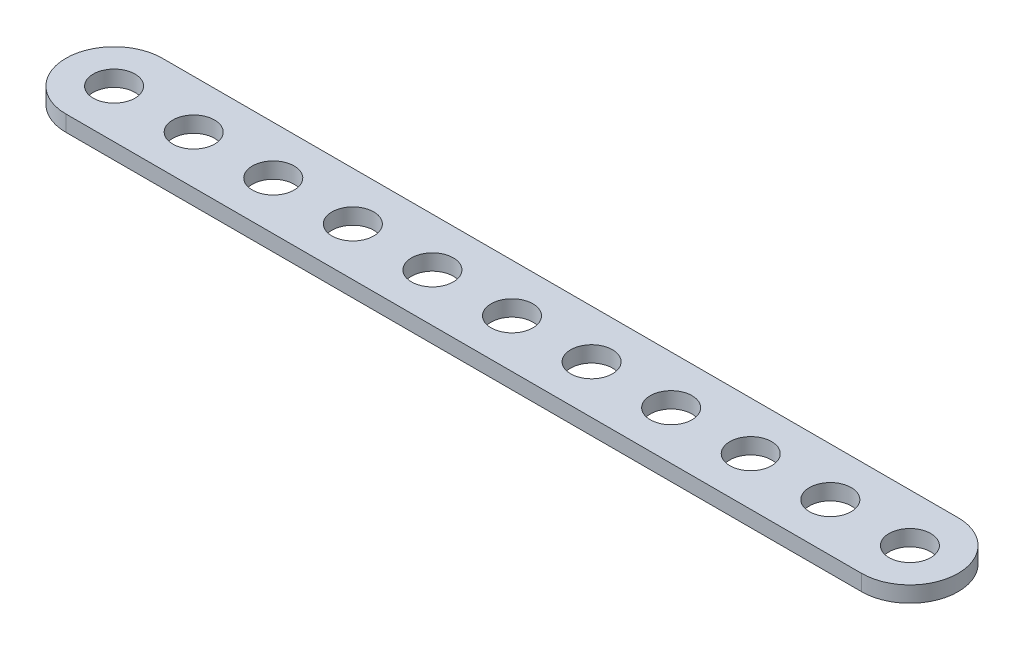
ISO-10303-21;
HEADER;
FILE_DESCRIPTION(('STEP AP214'),'2;1');
FILE_NAME('part.step','',(''),(''),'','','');
FILE_SCHEMA(('AUTOMOTIVE_DESIGN { 1 0 10303 214 1 1 1 1 }'));
ENDSEC;
DATA;
#1=APPLICATION_CONTEXT('core data for automotive mechanical design processes');
#2=APPLICATION_PROTOCOL_DEFINITION('international standard','automotive_design',2000,#1);
#3=PRODUCT_CONTEXT('',#1,'mechanical');
#4=PRODUCT('Part','Part','',(#3));
#5=PRODUCT_RELATED_PRODUCT_CATEGORY('part','',(#4));
#6=PRODUCT_DEFINITION_FORMATION('','',#4);
#7=PRODUCT_DEFINITION_CONTEXT('part definition',#1,'design');
#8=PRODUCT_DEFINITION('design','',#6,#7);
#9=PRODUCT_DEFINITION_SHAPE('','',#8);
#10=(LENGTH_UNIT() NAMED_UNIT(*) SI_UNIT(.MILLI.,.METRE.));
#11=(NAMED_UNIT(*) PLANE_ANGLE_UNIT() SI_UNIT($,.RADIAN.));
#12=(NAMED_UNIT(*) SI_UNIT($,.STERADIAN.) SOLID_ANGLE_UNIT());
#13=UNCERTAINTY_MEASURE_WITH_UNIT(LENGTH_MEASURE(1.E-05),#10,'distance_accuracy_value','');
#14=(GEOMETRIC_REPRESENTATION_CONTEXT(3) GLOBAL_UNCERTAINTY_ASSIGNED_CONTEXT((#13)) GLOBAL_UNIT_ASSIGNED_CONTEXT((#10,
#11,#12)) REPRESENTATION_CONTEXT('',''));
#15=CARTESIAN_POINT('',(0.,0.,0.));
#16=DIRECTION('',(0.,0.,1.));
#17=DIRECTION('',(1.,0.,0.));
#18=AXIS2_PLACEMENT_3D('',#15,#16,#17);
#19=CARTESIAN_POINT('',(0.,0.,0.));
#20=DIRECTION('',(0.,1.,0.));
#21=DIRECTION('',(0.,0.,1.));
#22=AXIS2_PLACEMENT_3D('',#19,#20,#21);
#23=PLANE('',#22);
#24=CARTESIAN_POINT('',(80.,0.,0.));
#25=DIRECTION('',(0.,-1.,0.));
#26=DIRECTION('',(0.,0.,-1.));
#27=AXIS2_PLACEMENT_3D('',#24,#25,#26);
#28=CIRCLE('',#27,4.85);
#29=CARTESIAN_POINT('',(80.,0.,4.85));
#30=VERTEX_POINT('',#29);
#31=CARTESIAN_POINT('',(80.,0.,-4.85));
#32=VERTEX_POINT('',#31);
#33=EDGE_CURVE('E55',#30,#32,#28,.F.);
#34=ORIENTED_EDGE('',*,*,#33,.F.);
#35=DIRECTION('',(-1.,0.,0.));
#36=VECTOR('',#35,1.);
#37=CARTESIAN_POINT('',(0.,0.,4.85));
#38=LINE('',#37,#36);
#39=CARTESIAN_POINT('',(0.,0.,4.85));
#40=VERTEX_POINT('',#39);
#41=EDGE_CURVE('E60',#30,#40,#38,.T.);
#42=ORIENTED_EDGE('',*,*,#41,.T.);
#43=CARTESIAN_POINT('',(0.,0.,0.));
#44=DIRECTION('',(0.,-1.,0.));
#45=DIRECTION('',(0.,0.,-1.));
#46=AXIS2_PLACEMENT_3D('',#43,#44,#45);
#47=CIRCLE('',#46,4.85);
#48=CARTESIAN_POINT('',(0.,0.,-4.85));
#49=VERTEX_POINT('',#48);
#50=EDGE_CURVE('E76',#49,#40,#47,.F.);
#51=ORIENTED_EDGE('',*,*,#50,.F.);
#52=DIRECTION('',(1.,0.,0.));
#53=VECTOR('',#52,1.);
#54=CARTESIAN_POINT('',(0.,0.,-4.85));
#55=LINE('',#54,#53);
#56=EDGE_CURVE('E61',#49,#32,#55,.T.);
#57=ORIENTED_EDGE('',*,*,#56,.T.);
#58=EDGE_LOOP('',(#34,#42,#51,#57));
#59=FACE_BOUND('',#58,.T.);
#60=CARTESIAN_POINT('',(0.,0.,0.));
#61=DIRECTION('',(0.,-1.,0.));
#62=DIRECTION('',(0.,0.,-1.));
#63=AXIS2_PLACEMENT_3D('',#60,#61,#62);
#64=CIRCLE('',#63,2.1);
#65=CARTESIAN_POINT('',(0.,0.,-2.1));
#66=VERTEX_POINT('',#65);
#67=EDGE_CURVE('E64',#66,#66,#64,.F.);
#68=ORIENTED_EDGE('',*,*,#67,.T.);
#69=EDGE_LOOP('',(#68));
#70=FACE_BOUND('',#69,.T.);
#71=CARTESIAN_POINT('',(24.,0.,0.));
#72=DIRECTION('',(0.,-1.,0.));
#73=DIRECTION('',(0.,0.,-1.));
#74=AXIS2_PLACEMENT_3D('',#71,#72,#73);
#75=CIRCLE('',#74,2.1);
#76=CARTESIAN_POINT('',(24.,0.,-2.1));
#77=VERTEX_POINT('',#76);
#78=EDGE_CURVE('E73',#77,#77,#75,.F.);
#79=ORIENTED_EDGE('',*,*,#78,.T.);
#80=EDGE_LOOP('',(#79));
#81=FACE_BOUND('',#80,.T.);
#82=CARTESIAN_POINT('',(8.,0.,0.));
#83=DIRECTION('',(0.,-1.,0.));
#84=DIRECTION('',(0.,0.,-1.));
#85=AXIS2_PLACEMENT_3D('',#82,#83,#84);
#86=CIRCLE('',#85,2.1);
#87=CARTESIAN_POINT('',(8.,0.,-2.1));
#88=VERTEX_POINT('',#87);
#89=EDGE_CURVE('E137',#88,#88,#86,.F.);
#90=ORIENTED_EDGE('',*,*,#89,.T.);
#91=EDGE_LOOP('',(#90));
#92=FACE_BOUND('',#91,.T.);
#93=CARTESIAN_POINT('',(16.,0.,0.));
#94=DIRECTION('',(0.,-1.,0.));
#95=DIRECTION('',(0.,0.,-1.));
#96=AXIS2_PLACEMENT_3D('',#93,#94,#95);
#97=CIRCLE('',#96,2.1);
#98=CARTESIAN_POINT('',(16.,0.,-2.1));
#99=VERTEX_POINT('',#98);
#100=EDGE_CURVE('E130',#99,#99,#97,.F.);
#101=ORIENTED_EDGE('',*,*,#100,.T.);
#102=EDGE_LOOP('',(#101));
#103=FACE_BOUND('',#102,.T.);
#104=CARTESIAN_POINT('',(32.,0.,0.));
#105=DIRECTION('',(0.,-1.,0.));
#106=DIRECTION('',(0.,0.,-1.));
#107=AXIS2_PLACEMENT_3D('',#104,#105,#106);
#108=CIRCLE('',#107,2.1);
#109=CARTESIAN_POINT('',(32.,0.,-2.1));
#110=VERTEX_POINT('',#109);
#111=EDGE_CURVE('E140',#110,#110,#108,.F.);
#112=ORIENTED_EDGE('',*,*,#111,.T.);
#113=EDGE_LOOP('',(#112));
#114=FACE_BOUND('',#113,.T.);
#115=CARTESIAN_POINT('',(40.,0.,0.));
#116=DIRECTION('',(0.,-1.,0.));
#117=DIRECTION('',(0.,0.,-1.));
#118=AXIS2_PLACEMENT_3D('',#115,#116,#117);
#119=CIRCLE('',#118,2.1);
#120=CARTESIAN_POINT('',(40.,0.,-2.1));
#121=VERTEX_POINT('',#120);
#122=EDGE_CURVE('E127',#121,#121,#119,.F.);
#123=ORIENTED_EDGE('',*,*,#122,.T.);
#124=EDGE_LOOP('',(#123));
#125=FACE_BOUND('',#124,.T.);
#126=CARTESIAN_POINT('',(48.,0.,0.));
#127=DIRECTION('',(0.,-1.,0.));
#128=DIRECTION('',(0.,0.,-1.));
#129=AXIS2_PLACEMENT_3D('',#126,#127,#128);
#130=CIRCLE('',#129,2.1);
#131=CARTESIAN_POINT('',(48.,0.,-2.1));
#132=VERTEX_POINT('',#131);
#133=EDGE_CURVE('E143',#132,#132,#130,.F.);
#134=ORIENTED_EDGE('',*,*,#133,.T.);
#135=EDGE_LOOP('',(#134));
#136=FACE_BOUND('',#135,.T.);
#137=CARTESIAN_POINT('',(56.,0.,0.));
#138=DIRECTION('',(0.,-1.,0.));
#139=DIRECTION('',(0.,0.,-1.));
#140=AXIS2_PLACEMENT_3D('',#137,#138,#139);
#141=CIRCLE('',#140,2.1);
#142=CARTESIAN_POINT('',(56.,0.,-2.1));
#143=VERTEX_POINT('',#142);
#144=EDGE_CURVE('E124',#143,#143,#141,.F.);
#145=ORIENTED_EDGE('',*,*,#144,.T.);
#146=EDGE_LOOP('',(#145));
#147=FACE_BOUND('',#146,.T.);
#148=CARTESIAN_POINT('',(64.,0.,0.));
#149=DIRECTION('',(0.,-1.,0.));
#150=DIRECTION('',(0.,0.,-1.));
#151=AXIS2_PLACEMENT_3D('',#148,#149,#150);
#152=CIRCLE('',#151,2.1);
#153=CARTESIAN_POINT('',(64.,0.,-2.1));
#154=VERTEX_POINT('',#153);
#155=EDGE_CURVE('E145',#154,#154,#152,.F.);
#156=ORIENTED_EDGE('',*,*,#155,.T.);
#157=EDGE_LOOP('',(#156));
#158=FACE_BOUND('',#157,.T.);
#159=CARTESIAN_POINT('',(72.,0.,0.));
#160=DIRECTION('',(0.,-1.,0.));
#161=DIRECTION('',(0.,0.,-1.));
#162=AXIS2_PLACEMENT_3D('',#159,#160,#161);
#163=CIRCLE('',#162,2.1);
#164=CARTESIAN_POINT('',(72.,0.,-2.1));
#165=VERTEX_POINT('',#164);
#166=EDGE_CURVE('E121',#165,#165,#163,.F.);
#167=ORIENTED_EDGE('',*,*,#166,.T.);
#168=EDGE_LOOP('',(#167));
#169=FACE_BOUND('',#168,.T.);
#170=CARTESIAN_POINT('',(80.,0.,0.));
#171=DIRECTION('',(0.,-1.,0.));
#172=DIRECTION('',(0.,0.,-1.));
#173=AXIS2_PLACEMENT_3D('',#170,#171,#172);
#174=CIRCLE('',#173,2.1);
#175=CARTESIAN_POINT('',(80.,0.,-2.1));
#176=VERTEX_POINT('',#175);
#177=EDGE_CURVE('E19',#176,#176,#174,.F.);
#178=ORIENTED_EDGE('',*,*,#177,.T.);
#179=EDGE_LOOP('',(#178));
#180=FACE_BOUND('',#179,.T.);
#181=ADVANCED_FACE('F16',(#59,#70,#81,#92,#103,#114,#125,#136,#147,#158,#169,#180),#23,.F.);
#182=CARTESIAN_POINT('',(80.,1.6,0.));
#183=DIRECTION('',(0.,-1.,0.));
#184=DIRECTION('',(0.,0.,-1.));
#185=AXIS2_PLACEMENT_3D('',#182,#183,#184);
#186=CYLINDRICAL_SURFACE('',#185,2.1);
#187=ORIENTED_EDGE('',*,*,#177,.F.);
#188=EDGE_LOOP('',(#187));
#189=FACE_BOUND('',#188,.T.);
#190=CARTESIAN_POINT('',(80.,1.6,0.));
#191=DIRECTION('',(0.,-1.,0.));
#192=DIRECTION('',(0.,0.,-1.));
#193=AXIS2_PLACEMENT_3D('',#190,#191,#192);
#194=CIRCLE('',#193,2.1);
#195=CARTESIAN_POINT('',(80.,1.6,-2.1));
#196=VERTEX_POINT('',#195);
#197=EDGE_CURVE('E118',#196,#196,#194,.T.);
#198=ORIENTED_EDGE('',*,*,#197,.F.);
#199=EDGE_LOOP('',(#198));
#200=FACE_BOUND('',#199,.T.);
#201=ADVANCED_FACE('F153',(#189,#200),#186,.F.);
#202=CARTESIAN_POINT('',(64.,1.6,0.));
#203=DIRECTION('',(0.,-1.,0.));
#204=DIRECTION('',(0.,0.,-1.));
#205=AXIS2_PLACEMENT_3D('',#202,#203,#204);
#206=CYLINDRICAL_SURFACE('',#205,2.1);
#207=ORIENTED_EDGE('',*,*,#155,.F.);
#208=EDGE_LOOP('',(#207));
#209=FACE_BOUND('',#208,.T.);
#210=CARTESIAN_POINT('',(64.,1.6,0.));
#211=DIRECTION('',(0.,-1.,0.));
#212=DIRECTION('',(0.,0.,-1.));
#213=AXIS2_PLACEMENT_3D('',#210,#211,#212);
#214=CIRCLE('',#213,2.1);
#215=CARTESIAN_POINT('',(64.,1.6,-2.1));
#216=VERTEX_POINT('',#215);
#217=EDGE_CURVE('E115',#216,#216,#214,.T.);
#218=ORIENTED_EDGE('',*,*,#217,.F.);
#219=EDGE_LOOP('',(#218));
#220=FACE_BOUND('',#219,.T.);
#221=ADVANCED_FACE('F156',(#209,#220),#206,.F.);
#222=CARTESIAN_POINT('',(48.,1.6,0.));
#223=DIRECTION('',(0.,-1.,0.));
#224=DIRECTION('',(0.,0.,-1.));
#225=AXIS2_PLACEMENT_3D('',#222,#223,#224);
#226=CYLINDRICAL_SURFACE('',#225,2.1);
#227=ORIENTED_EDGE('',*,*,#133,.F.);
#228=EDGE_LOOP('',(#227));
#229=FACE_BOUND('',#228,.T.);
#230=CARTESIAN_POINT('',(48.,1.6,0.));
#231=DIRECTION('',(0.,-1.,0.));
#232=DIRECTION('',(0.,0.,-1.));
#233=AXIS2_PLACEMENT_3D('',#230,#231,#232);
#234=CIRCLE('',#233,2.1);
#235=CARTESIAN_POINT('',(48.,1.6,-2.1));
#236=VERTEX_POINT('',#235);
#237=EDGE_CURVE('E112',#236,#236,#234,.T.);
#238=ORIENTED_EDGE('',*,*,#237,.F.);
#239=EDGE_LOOP('',(#238));
#240=FACE_BOUND('',#239,.T.);
#241=ADVANCED_FACE('F210',(#229,#240),#226,.F.);
#242=CARTESIAN_POINT('',(32.,1.6,0.));
#243=DIRECTION('',(0.,-1.,0.));
#244=DIRECTION('',(0.,0.,-1.));
#245=AXIS2_PLACEMENT_3D('',#242,#243,#244);
#246=CYLINDRICAL_SURFACE('',#245,2.1);
#247=ORIENTED_EDGE('',*,*,#111,.F.);
#248=EDGE_LOOP('',(#247));
#249=FACE_BOUND('',#248,.T.);
#250=CARTESIAN_POINT('',(32.,1.6,0.));
#251=DIRECTION('',(0.,-1.,0.));
#252=DIRECTION('',(0.,0.,-1.));
#253=AXIS2_PLACEMENT_3D('',#250,#251,#252);
#254=CIRCLE('',#253,2.1);
#255=CARTESIAN_POINT('',(32.,1.6,-2.1));
#256=VERTEX_POINT('',#255);
#257=EDGE_CURVE('E109',#256,#256,#254,.T.);
#258=ORIENTED_EDGE('',*,*,#257,.F.);
#259=EDGE_LOOP('',(#258));
#260=FACE_BOUND('',#259,.T.);
#261=ADVANCED_FACE('F206',(#249,#260),#246,.F.);
#262=CARTESIAN_POINT('',(8.,1.6,0.));
#263=DIRECTION('',(0.,-1.,0.));
#264=DIRECTION('',(0.,0.,-1.));
#265=AXIS2_PLACEMENT_3D('',#262,#263,#264);
#266=CYLINDRICAL_SURFACE('',#265,2.1);
#267=ORIENTED_EDGE('',*,*,#89,.F.);
#268=EDGE_LOOP('',(#267));
#269=FACE_BOUND('',#268,.T.);
#270=CARTESIAN_POINT('',(8.,1.6,0.));
#271=DIRECTION('',(0.,-1.,0.));
#272=DIRECTION('',(0.,0.,-1.));
#273=AXIS2_PLACEMENT_3D('',#270,#271,#272);
#274=CIRCLE('',#273,2.1);
#275=CARTESIAN_POINT('',(8.,1.6,-2.1));
#276=VERTEX_POINT('',#275);
#277=EDGE_CURVE('E106',#276,#276,#274,.T.);
#278=ORIENTED_EDGE('',*,*,#277,.F.);
#279=EDGE_LOOP('',(#278));
#280=FACE_BOUND('',#279,.T.);
#281=ADVANCED_FACE('F202',(#269,#280),#266,.F.);
#282=CARTESIAN_POINT('',(0.,1.6,0.));
#283=DIRECTION('',(0.,-1.,0.));
#284=DIRECTION('',(0.,0.,-1.));
#285=AXIS2_PLACEMENT_3D('',#282,#283,#284);
#286=CYLINDRICAL_SURFACE('',#285,2.1);
#287=ORIENTED_EDGE('',*,*,#67,.F.);
#288=EDGE_LOOP('',(#287));
#289=FACE_BOUND('',#288,.T.);
#290=CARTESIAN_POINT('',(0.,1.6,0.));
#291=DIRECTION('',(0.,-1.,0.));
#292=DIRECTION('',(0.,0.,-1.));
#293=AXIS2_PLACEMENT_3D('',#290,#291,#292);
#294=CIRCLE('',#293,2.1);
#295=CARTESIAN_POINT('',(0.,1.6,-2.1));
#296=VERTEX_POINT('',#295);
#297=EDGE_CURVE('E103',#296,#296,#294,.T.);
#298=ORIENTED_EDGE('',*,*,#297,.F.);
#299=EDGE_LOOP('',(#298));
#300=FACE_BOUND('',#299,.T.);
#301=ADVANCED_FACE('F199',(#289,#300),#286,.F.);
#302=CARTESIAN_POINT('',(80.,1.6,0.));
#303=DIRECTION('',(0.,-1.,0.));
#304=DIRECTION('',(0.,0.,-1.));
#305=AXIS2_PLACEMENT_3D('',#302,#303,#304);
#306=CYLINDRICAL_SURFACE('',#305,4.85);
#307=ORIENTED_EDGE('',*,*,#33,.T.);
#308=DIRECTION('',(0.,1.,0.));
#309=VECTOR('',#308,1.);
#310=CARTESIAN_POINT('',(80.,1.6,-4.85));
#311=LINE('',#310,#309);
#312=CARTESIAN_POINT('',(80.,1.6,-4.85));
#313=VERTEX_POINT('',#312);
#314=EDGE_CURVE('E83',#32,#313,#311,.T.);
#315=ORIENTED_EDGE('',*,*,#314,.T.);
#316=CARTESIAN_POINT('',(80.,1.6,0.));
#317=DIRECTION('',(0.,-1.,0.));
#318=DIRECTION('',(0.,0.,-1.));
#319=AXIS2_PLACEMENT_3D('',#316,#317,#318);
#320=CIRCLE('',#319,4.85);
#321=CARTESIAN_POINT('',(80.,1.6,4.85));
#322=VERTEX_POINT('',#321);
#323=EDGE_CURVE('E70',#322,#313,#320,.F.);
#324=ORIENTED_EDGE('',*,*,#323,.F.);
#325=DIRECTION('',(0.,1.,0.));
#326=VECTOR('',#325,1.);
#327=CARTESIAN_POINT('',(80.,1.6,4.85));
#328=LINE('',#327,#326);
#329=EDGE_CURVE('E67',#322,#30,#328,.F.);
#330=ORIENTED_EDGE('',*,*,#329,.T.);
#331=EDGE_LOOP('',(#307,#315,#324,#330));
#332=FACE_BOUND('',#331,.T.);
#333=ADVANCED_FACE('F68',(#332),#306,.T.);
#334=CARTESIAN_POINT('',(0.,1.6,-4.85));
#335=DIRECTION('',(0.,0.,1.));
#336=DIRECTION('',(1.,0.,0.));
#337=AXIS2_PLACEMENT_3D('',#334,#335,#336);
#338=PLANE('',#337);
#339=DIRECTION('',(1.,0.,0.));
#340=VECTOR('',#339,1.);
#341=CARTESIAN_POINT('',(0.,1.6,-4.85));
#342=LINE('',#341,#340);
#343=CARTESIAN_POINT('',(0.,1.6,-4.85));
#344=VERTEX_POINT('',#343);
#345=EDGE_CURVE('E101',#313,#344,#342,.F.);
#346=ORIENTED_EDGE('',*,*,#345,.F.);
#347=ORIENTED_EDGE('',*,*,#314,.F.);
#348=ORIENTED_EDGE('',*,*,#56,.F.);
#349=DIRECTION('',(0.,-1.,0.));
#350=VECTOR('',#349,1.);
#351=CARTESIAN_POINT('',(0.,1.6,-4.85));
#352=LINE('',#351,#350);
#353=EDGE_CURVE('E79',#344,#49,#352,.T.);
#354=ORIENTED_EDGE('',*,*,#353,.F.);
#355=EDGE_LOOP('',(#346,#347,#348,#354));
#356=FACE_BOUND('',#355,.T.);
#357=ADVANCED_FACE('F193',(#356),#338,.F.);
#358=CARTESIAN_POINT('',(0.,1.6,0.));
#359=DIRECTION('',(0.,-1.,0.));
#360=DIRECTION('',(0.,0.,-1.));
#361=AXIS2_PLACEMENT_3D('',#358,#359,#360);
#362=CYLINDRICAL_SURFACE('',#361,4.85);
#363=ORIENTED_EDGE('',*,*,#50,.T.);
#364=DIRECTION('',(0.,1.,0.));
#365=VECTOR('',#364,1.);
#366=CARTESIAN_POINT('',(0.,1.6,4.85));
#367=LINE('',#366,#365);
#368=CARTESIAN_POINT('',(0.,1.6,4.85));
#369=VERTEX_POINT('',#368);
#370=EDGE_CURVE('E34',#40,#369,#367,.T.);
#371=ORIENTED_EDGE('',*,*,#370,.T.);
#372=CARTESIAN_POINT('',(0.,1.6,0.));
#373=DIRECTION('',(0.,-1.,0.));
#374=DIRECTION('',(0.,0.,-1.));
#375=AXIS2_PLACEMENT_3D('',#372,#373,#374);
#376=CIRCLE('',#375,4.85);
#377=EDGE_CURVE('E98',#344,#369,#376,.F.);
#378=ORIENTED_EDGE('',*,*,#377,.F.);
#379=ORIENTED_EDGE('',*,*,#353,.T.);
#380=EDGE_LOOP('',(#363,#371,#378,#379));
#381=FACE_BOUND('',#380,.T.);
#382=ADVANCED_FACE('F190',(#381),#362,.T.);
#383=CARTESIAN_POINT('',(0.,1.6,4.85));
#384=DIRECTION('',(0.,0.,-1.));
#385=DIRECTION('',(-1.,0.,0.));
#386=AXIS2_PLACEMENT_3D('',#383,#384,#385);
#387=PLANE('',#386);
#388=DIRECTION('',(1.,0.,0.));
#389=VECTOR('',#388,1.);
#390=CARTESIAN_POINT('',(0.,1.6,4.85));
#391=LINE('',#390,#389);
#392=EDGE_CURVE('E97',#369,#322,#391,.T.);
#393=ORIENTED_EDGE('',*,*,#392,.F.);
#394=ORIENTED_EDGE('',*,*,#370,.F.);
#395=ORIENTED_EDGE('',*,*,#41,.F.);
#396=ORIENTED_EDGE('',*,*,#329,.F.);
#397=EDGE_LOOP('',(#393,#394,#395,#396));
#398=FACE_BOUND('',#397,.T.);
#399=ADVANCED_FACE('F75',(#398),#387,.F.);
#400=CARTESIAN_POINT('',(24.,1.6,0.));
#401=DIRECTION('',(0.,-1.,0.));
#402=DIRECTION('',(0.,0.,-1.));
#403=AXIS2_PLACEMENT_3D('',#400,#401,#402);
#404=CYLINDRICAL_SURFACE('',#403,2.1);
#405=ORIENTED_EDGE('',*,*,#78,.F.);
#406=EDGE_LOOP('',(#405));
#407=FACE_BOUND('',#406,.T.);
#408=CARTESIAN_POINT('',(24.,1.6,0.));
#409=DIRECTION('',(0.,-1.,0.));
#410=DIRECTION('',(0.,0.,-1.));
#411=AXIS2_PLACEMENT_3D('',#408,#409,#410);
#412=CIRCLE('',#411,2.1);
#413=CARTESIAN_POINT('',(24.,1.6,-2.1));
#414=VERTEX_POINT('',#413);
#415=EDGE_CURVE('E94',#414,#414,#412,.T.);
#416=ORIENTED_EDGE('',*,*,#415,.F.);
#417=EDGE_LOOP('',(#416));
#418=FACE_BOUND('',#417,.T.);
#419=ADVANCED_FACE('F183',(#407,#418),#404,.F.);
#420=CARTESIAN_POINT('',(16.,1.6,0.));
#421=DIRECTION('',(0.,-1.,0.));
#422=DIRECTION('',(0.,0.,-1.));
#423=AXIS2_PLACEMENT_3D('',#420,#421,#422);
#424=CYLINDRICAL_SURFACE('',#423,2.1);
#425=ORIENTED_EDGE('',*,*,#100,.F.);
#426=EDGE_LOOP('',(#425));
#427=FACE_BOUND('',#426,.T.);
#428=CARTESIAN_POINT('',(16.,1.6,0.));
#429=DIRECTION('',(0.,-1.,0.));
#430=DIRECTION('',(0.,0.,-1.));
#431=AXIS2_PLACEMENT_3D('',#428,#429,#430);
#432=CIRCLE('',#431,2.1);
#433=CARTESIAN_POINT('',(16.,1.6,-2.1));
#434=VERTEX_POINT('',#433);
#435=EDGE_CURVE('E91',#434,#434,#432,.T.);
#436=ORIENTED_EDGE('',*,*,#435,.F.);
#437=EDGE_LOOP('',(#436));
#438=FACE_BOUND('',#437,.T.);
#439=ADVANCED_FACE('F179',(#427,#438),#424,.F.);
#440=CARTESIAN_POINT('',(40.,1.6,0.));
#441=DIRECTION('',(0.,-1.,0.));
#442=DIRECTION('',(0.,0.,-1.));
#443=AXIS2_PLACEMENT_3D('',#440,#441,#442);
#444=CYLINDRICAL_SURFACE('',#443,2.1);
#445=ORIENTED_EDGE('',*,*,#122,.F.);
#446=EDGE_LOOP('',(#445));
#447=FACE_BOUND('',#446,.T.);
#448=CARTESIAN_POINT('',(40.,1.6,0.));
#449=DIRECTION('',(0.,-1.,0.));
#450=DIRECTION('',(0.,0.,-1.));
#451=AXIS2_PLACEMENT_3D('',#448,#449,#450);
#452=CIRCLE('',#451,2.1);
#453=CARTESIAN_POINT('',(40.,1.6,-2.1));
#454=VERTEX_POINT('',#453);
#455=EDGE_CURVE('E88',#454,#454,#452,.T.);
#456=ORIENTED_EDGE('',*,*,#455,.F.);
#457=EDGE_LOOP('',(#456));
#458=FACE_BOUND('',#457,.T.);
#459=ADVANCED_FACE('F175',(#447,#458),#444,.F.);
#460=CARTESIAN_POINT('',(56.,1.6,0.));
#461=DIRECTION('',(0.,-1.,0.));
#462=DIRECTION('',(0.,0.,-1.));
#463=AXIS2_PLACEMENT_3D('',#460,#461,#462);
#464=CYLINDRICAL_SURFACE('',#463,2.1);
#465=ORIENTED_EDGE('',*,*,#144,.F.);
#466=EDGE_LOOP('',(#465));
#467=FACE_BOUND('',#466,.T.);
#468=CARTESIAN_POINT('',(56.,1.6,0.));
#469=DIRECTION('',(0.,-1.,0.));
#470=DIRECTION('',(0.,0.,-1.));
#471=AXIS2_PLACEMENT_3D('',#468,#469,#470);
#472=CIRCLE('',#471,2.1);
#473=CARTESIAN_POINT('',(56.,1.6,-2.1));
#474=VERTEX_POINT('',#473);
#475=EDGE_CURVE('E25',#474,#474,#472,.T.);
#476=ORIENTED_EDGE('',*,*,#475,.F.);
#477=EDGE_LOOP('',(#476));
#478=FACE_BOUND('',#477,.T.);
#479=ADVANCED_FACE('F168',(#467,#478),#464,.F.);
#480=CARTESIAN_POINT('',(72.,1.6,0.));
#481=DIRECTION('',(0.,-1.,0.));
#482=DIRECTION('',(0.,0.,-1.));
#483=AXIS2_PLACEMENT_3D('',#480,#481,#482);
#484=CYLINDRICAL_SURFACE('',#483,2.1);
#485=ORIENTED_EDGE('',*,*,#166,.F.);
#486=EDGE_LOOP('',(#485));
#487=FACE_BOUND('',#486,.T.);
#488=CARTESIAN_POINT('',(72.,1.6,0.));
#489=DIRECTION('',(0.,-1.,0.));
#490=DIRECTION('',(0.,0.,-1.));
#491=AXIS2_PLACEMENT_3D('',#488,#489,#490);
#492=CIRCLE('',#491,2.1);
#493=CARTESIAN_POINT('',(72.,1.6,-2.1));
#494=VERTEX_POINT('',#493);
#495=EDGE_CURVE('E9',#494,#494,#492,.T.);
#496=ORIENTED_EDGE('',*,*,#495,.F.);
#497=EDGE_LOOP('',(#496));
#498=FACE_BOUND('',#497,.T.);
#499=ADVANCED_FACE('F161',(#487,#498),#484,.F.);
#500=CARTESIAN_POINT('',(0.,1.6,0.));
#501=DIRECTION('',(0.,1.,0.));
#502=DIRECTION('',(0.,0.,1.));
#503=AXIS2_PLACEMENT_3D('',#500,#501,#502);
#504=PLANE('',#503);
#505=ORIENTED_EDGE('',*,*,#495,.T.);
#506=EDGE_LOOP('',(#505));
#507=FACE_BOUND('',#506,.T.);
#508=ORIENTED_EDGE('',*,*,#475,.T.);
#509=EDGE_LOOP('',(#508));
#510=FACE_BOUND('',#509,.T.);
#511=ORIENTED_EDGE('',*,*,#455,.T.);
#512=EDGE_LOOP('',(#511));
#513=FACE_BOUND('',#512,.T.);
#514=ORIENTED_EDGE('',*,*,#435,.T.);
#515=EDGE_LOOP('',(#514));
#516=FACE_BOUND('',#515,.T.);
#517=ORIENTED_EDGE('',*,*,#415,.T.);
#518=EDGE_LOOP('',(#517));
#519=FACE_BOUND('',#518,.T.);
#520=ORIENTED_EDGE('',*,*,#377,.T.);
#521=ORIENTED_EDGE('',*,*,#392,.T.);
#522=ORIENTED_EDGE('',*,*,#323,.T.);
#523=ORIENTED_EDGE('',*,*,#345,.T.);
#524=EDGE_LOOP('',(#520,#521,#522,#523));
#525=FACE_BOUND('',#524,.T.);
#526=ORIENTED_EDGE('',*,*,#297,.T.);
#527=EDGE_LOOP('',(#526));
#528=FACE_BOUND('',#527,.T.);
#529=ORIENTED_EDGE('',*,*,#277,.T.);
#530=EDGE_LOOP('',(#529));
#531=FACE_BOUND('',#530,.T.);
#532=ORIENTED_EDGE('',*,*,#257,.T.);
#533=EDGE_LOOP('',(#532));
#534=FACE_BOUND('',#533,.T.);
#535=ORIENTED_EDGE('',*,*,#237,.T.);
#536=EDGE_LOOP('',(#535));
#537=FACE_BOUND('',#536,.T.);
#538=ORIENTED_EDGE('',*,*,#217,.T.);
#539=EDGE_LOOP('',(#538));
#540=FACE_BOUND('',#539,.T.);
#541=ORIENTED_EDGE('',*,*,#197,.T.);
#542=EDGE_LOOP('',(#541));
#543=FACE_BOUND('',#542,.T.);
#544=ADVANCED_FACE('F159',(#507,#510,#513,#516,#519,#525,#528,#531,#534,#537,#540,#543),#504,.T.);
#545=CLOSED_SHELL('',(#181,#201,#221,#241,#261,#281,#301,#333,#357,#382,#399,#419,#439,#459,
#479,#499,#544));
#546=MANIFOLD_SOLID_BREP('B1',#545);
#547=ADVANCED_BREP_SHAPE_REPRESENTATION('',(#18,#546),#14);
#548=SHAPE_DEFINITION_REPRESENTATION(#9,#547);
ENDSEC;
END-ISO-10303-21;
